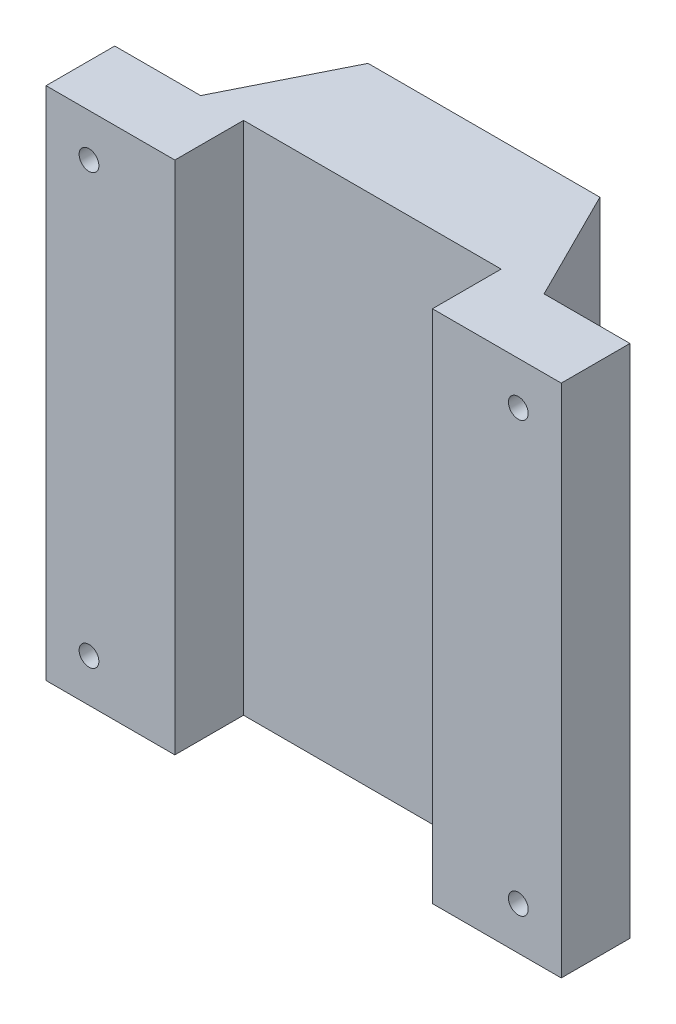
ISO-10303-21;
HEADER;
FILE_DESCRIPTION(('STEP AP214'),'2;1');
FILE_NAME('part.step','',(''),(''),'','','');
FILE_SCHEMA(('AUTOMOTIVE_DESIGN { 1 0 10303 214 1 1 1 1 }'));
ENDSEC;
DATA;
#1=APPLICATION_CONTEXT('core data for automotive mechanical design processes');
#2=APPLICATION_PROTOCOL_DEFINITION('international standard','automotive_design',2000,#1);
#3=PRODUCT_CONTEXT('',#1,'mechanical');
#4=PRODUCT('Part','Part','',(#3));
#5=PRODUCT_RELATED_PRODUCT_CATEGORY('part','',(#4));
#6=PRODUCT_DEFINITION_FORMATION('','',#4);
#7=PRODUCT_DEFINITION_CONTEXT('part definition',#1,'design');
#8=PRODUCT_DEFINITION('design','',#6,#7);
#9=PRODUCT_DEFINITION_SHAPE('','',#8);
#10=(LENGTH_UNIT() NAMED_UNIT(*) SI_UNIT(.MILLI.,.METRE.));
#11=(NAMED_UNIT(*) PLANE_ANGLE_UNIT() SI_UNIT($,.RADIAN.));
#12=(NAMED_UNIT(*) SI_UNIT($,.STERADIAN.) SOLID_ANGLE_UNIT());
#13=UNCERTAINTY_MEASURE_WITH_UNIT(LENGTH_MEASURE(1.E-05),#10,'distance_accuracy_value','');
#14=(GEOMETRIC_REPRESENTATION_CONTEXT(3) GLOBAL_UNCERTAINTY_ASSIGNED_CONTEXT((#13)) GLOBAL_UNIT_ASSIGNED_CONTEXT((#10,
#11,#12)) REPRESENTATION_CONTEXT('',''));
#15=CARTESIAN_POINT('',(0.,0.,0.));
#16=DIRECTION('',(0.,0.,1.));
#17=DIRECTION('',(1.,0.,0.));
#18=AXIS2_PLACEMENT_3D('',#15,#16,#17);
#19=CARTESIAN_POINT('',(30.,30.,13.));
#20=DIRECTION('',(-1.,0.,0.));
#21=DIRECTION('',(0.,0.,1.));
#22=AXIS2_PLACEMENT_3D('',#19,#20,#21);
#23=PLANE('',#22);
#24=DIRECTION('',(0.,1.,0.));
#25=VECTOR('',#24,1.);
#26=CARTESIAN_POINT('',(30.,-30.,13.));
#27=LINE('',#26,#25);
#28=CARTESIAN_POINT('',(30.,-30.,13.));
#29=VERTEX_POINT('',#28);
#30=CARTESIAN_POINT('',(30.,30.,13.));
#31=VERTEX_POINT('',#30);
#32=EDGE_CURVE('E186',#29,#31,#27,.T.);
#33=ORIENTED_EDGE('',*,*,#32,.T.);
#34=DIRECTION('',(0.,0.,-1.));
#35=VECTOR('',#34,1.);
#36=CARTESIAN_POINT('',(30.,30.,13.));
#37=LINE('',#36,#35);
#38=CARTESIAN_POINT('',(30.,30.,21.));
#39=VERTEX_POINT('',#38);
#40=EDGE_CURVE('E11',#39,#31,#37,.T.);
#41=ORIENTED_EDGE('',*,*,#40,.F.);
#42=DIRECTION('',(0.,1.,0.));
#43=VECTOR('',#42,1.);
#44=CARTESIAN_POINT('',(30.,0.,21.));
#45=LINE('',#44,#43);
#46=CARTESIAN_POINT('',(30.,-30.,21.));
#47=VERTEX_POINT('',#46);
#48=EDGE_CURVE('E246',#47,#39,#45,.T.);
#49=ORIENTED_EDGE('',*,*,#48,.F.);
#50=DIRECTION('',(0.,0.,-1.));
#51=VECTOR('',#50,1.);
#52=CARTESIAN_POINT('',(30.,-30.,13.));
#53=LINE('',#52,#51);
#54=EDGE_CURVE('E295',#47,#29,#53,.T.);
#55=ORIENTED_EDGE('',*,*,#54,.T.);
#56=EDGE_LOOP('',(#33,#41,#49,#55));
#57=FACE_BOUND('',#56,.T.);
#58=ADVANCED_FACE('F41',(#57),#23,.F.);
#59=CARTESIAN_POINT('',(-30.,30.,13.));
#60=DIRECTION('',(0.,-1.,0.));
#61=DIRECTION('',(0.,0.,-1.));
#62=AXIS2_PLACEMENT_3D('',#59,#60,#61);
#63=PLANE('',#62);
#64=DIRECTION('',(0.447213595499958,0.,-0.894427190999916));
#65=VECTOR('',#64,1.);
#66=CARTESIAN_POINT('',(-10.8,30.,-5.4));
#67=LINE('',#66,#65);
#68=CARTESIAN_POINT('',(-20.,30.,13.));
#69=VERTEX_POINT('',#68);
#70=CARTESIAN_POINT('',(-13.5,30.,0.));
#71=VERTEX_POINT('',#70);
#72=EDGE_CURVE('E58',#69,#71,#67,.T.);
#73=ORIENTED_EDGE('',*,*,#72,.F.);
#74=DIRECTION('',(1.,0.,0.));
#75=VECTOR('',#74,1.);
#76=CARTESIAN_POINT('',(0.,30.,13.));
#77=LINE('',#76,#75);
#78=CARTESIAN_POINT('',(-30.,30.,13.));
#79=VERTEX_POINT('',#78);
#80=EDGE_CURVE('E140',#79,#69,#77,.T.);
#81=ORIENTED_EDGE('',*,*,#80,.F.);
#82=DIRECTION('',(0.,0.,-1.));
#83=VECTOR('',#82,1.);
#84=CARTESIAN_POINT('',(-30.,30.,13.));
#85=LINE('',#84,#83);
#86=CARTESIAN_POINT('',(-30.,30.,21.));
#87=VERTEX_POINT('',#86);
#88=EDGE_CURVE('E50',#87,#79,#85,.T.);
#89=ORIENTED_EDGE('',*,*,#88,.F.);
#90=DIRECTION('',(-1.,0.,0.));
#91=VECTOR('',#90,1.);
#92=CARTESIAN_POINT('',(0.,30.,21.));
#93=LINE('',#92,#91);
#94=CARTESIAN_POINT('',(-15.,30.,21.));
#95=VERTEX_POINT('',#94);
#96=EDGE_CURVE('E266',#95,#87,#93,.T.);
#97=ORIENTED_EDGE('',*,*,#96,.F.);
#98=DIRECTION('',(0.,0.,-1.));
#99=VECTOR('',#98,1.);
#100=CARTESIAN_POINT('',(-15.,30.,21.));
#101=LINE('',#100,#99);
#102=CARTESIAN_POINT('',(-15.,30.,13.));
#103=VERTEX_POINT('',#102);
#104=EDGE_CURVE('E283',#95,#103,#101,.T.);
#105=ORIENTED_EDGE('',*,*,#104,.T.);
#106=DIRECTION('',(-1.,0.,0.));
#107=VECTOR('',#106,1.);
#108=CARTESIAN_POINT('',(-30.,30.,13.));
#109=LINE('',#108,#107);
#110=CARTESIAN_POINT('',(15.,30.,13.));
#111=VERTEX_POINT('',#110);
#112=EDGE_CURVE('E288',#111,#103,#109,.T.);
#113=ORIENTED_EDGE('',*,*,#112,.F.);
#114=DIRECTION('',(0.,0.,-1.));
#115=VECTOR('',#114,1.);
#116=CARTESIAN_POINT('',(15.,30.,21.));
#117=LINE('',#116,#115);
#118=CARTESIAN_POINT('',(15.,30.,21.));
#119=VERTEX_POINT('',#118);
#120=EDGE_CURVE('E257',#119,#111,#117,.T.);
#121=ORIENTED_EDGE('',*,*,#120,.F.);
#122=DIRECTION('',(-1.,0.,0.));
#123=VECTOR('',#122,1.);
#124=CARTESIAN_POINT('',(0.,30.,21.));
#125=LINE('',#124,#123);
#126=EDGE_CURVE('E235',#39,#119,#125,.T.);
#127=ORIENTED_EDGE('',*,*,#126,.F.);
#128=ORIENTED_EDGE('',*,*,#40,.T.);
#129=DIRECTION('',(-1.,0.,0.));
#130=VECTOR('',#129,1.);
#131=CARTESIAN_POINT('',(0.,30.,13.));
#132=LINE('',#131,#130);
#133=CARTESIAN_POINT('',(20.,30.,13.));
#134=VERTEX_POINT('',#133);
#135=EDGE_CURVE('E173',#31,#134,#132,.T.);
#136=ORIENTED_EDGE('',*,*,#135,.T.);
#137=DIRECTION('',(-0.447213595499959,0.,-0.894427190999915));
#138=VECTOR('',#137,1.);
#139=CARTESIAN_POINT('',(10.8,30.,-5.40000000000001));
#140=LINE('',#139,#138);
#141=CARTESIAN_POINT('',(13.5,30.,0.));
#142=VERTEX_POINT('',#141);
#143=EDGE_CURVE('E177',#134,#142,#140,.T.);
#144=ORIENTED_EDGE('',*,*,#143,.T.);
#145=DIRECTION('',(-1.,0.,0.));
#146=VECTOR('',#145,1.);
#147=CARTESIAN_POINT('',(-30.,30.,0.));
#148=LINE('',#147,#146);
#149=EDGE_CURVE('E287',#142,#71,#148,.T.);
#150=ORIENTED_EDGE('',*,*,#149,.T.);
#151=EDGE_LOOP('',(#73,#81,#89,#97,#105,#113,#121,#127,#128,#136,#144,#150));
#152=FACE_BOUND('',#151,.T.);
#153=ADVANCED_FACE('F349',(#152),#63,.F.);
#154=CARTESIAN_POINT('',(-30.,-30.,13.));
#155=DIRECTION('',(0.,1.,0.));
#156=DIRECTION('',(0.,0.,1.));
#157=AXIS2_PLACEMENT_3D('',#154,#155,#156);
#158=PLANE('',#157);
#159=DIRECTION('',(0.,0.,-1.));
#160=VECTOR('',#159,1.);
#161=CARTESIAN_POINT('',(-30.,-30.,13.));
#162=LINE('',#161,#160);
#163=CARTESIAN_POINT('',(-30.,-30.,21.));
#164=VERTEX_POINT('',#163);
#165=CARTESIAN_POINT('',(-30.,-30.,13.));
#166=VERTEX_POINT('',#165);
#167=EDGE_CURVE('E155',#164,#166,#162,.T.);
#168=ORIENTED_EDGE('',*,*,#167,.T.);
#169=DIRECTION('',(1.,0.,0.));
#170=VECTOR('',#169,1.);
#171=CARTESIAN_POINT('',(0.,-30.,13.));
#172=LINE('',#171,#170);
#173=CARTESIAN_POINT('',(-20.,-30.,13.));
#174=VERTEX_POINT('',#173);
#175=EDGE_CURVE('E137',#166,#174,#172,.T.);
#176=ORIENTED_EDGE('',*,*,#175,.T.);
#177=DIRECTION('',(0.447213595499958,0.,-0.894427190999916));
#178=VECTOR('',#177,1.);
#179=CARTESIAN_POINT('',(-10.8,-30.,-5.4));
#180=LINE('',#179,#178);
#181=CARTESIAN_POINT('',(-13.5,-30.,0.));
#182=VERTEX_POINT('',#181);
#183=EDGE_CURVE('E143',#174,#182,#180,.T.);
#184=ORIENTED_EDGE('',*,*,#183,.T.);
#185=DIRECTION('',(1.,0.,0.));
#186=VECTOR('',#185,1.);
#187=CARTESIAN_POINT('',(-30.,-30.,0.));
#188=LINE('',#187,#186);
#189=CARTESIAN_POINT('',(13.5,-30.,0.));
#190=VERTEX_POINT('',#189);
#191=EDGE_CURVE('E292',#182,#190,#188,.T.);
#192=ORIENTED_EDGE('',*,*,#191,.T.);
#193=DIRECTION('',(-0.447213595499959,0.,-0.894427190999915));
#194=VECTOR('',#193,1.);
#195=CARTESIAN_POINT('',(10.8,-30.,-5.40000000000001));
#196=LINE('',#195,#194);
#197=CARTESIAN_POINT('',(20.,-30.,13.));
#198=VERTEX_POINT('',#197);
#199=EDGE_CURVE('E66',#198,#190,#196,.T.);
#200=ORIENTED_EDGE('',*,*,#199,.F.);
#201=DIRECTION('',(-1.,0.,0.));
#202=VECTOR('',#201,1.);
#203=CARTESIAN_POINT('',(0.,-30.,13.));
#204=LINE('',#203,#202);
#205=EDGE_CURVE('E172',#29,#198,#204,.T.);
#206=ORIENTED_EDGE('',*,*,#205,.F.);
#207=ORIENTED_EDGE('',*,*,#54,.F.);
#208=DIRECTION('',(1.,0.,0.));
#209=VECTOR('',#208,1.);
#210=CARTESIAN_POINT('',(0.,-30.,21.));
#211=LINE('',#210,#209);
#212=CARTESIAN_POINT('',(15.,-30.,21.));
#213=VERTEX_POINT('',#212);
#214=EDGE_CURVE('E242',#213,#47,#211,.T.);
#215=ORIENTED_EDGE('',*,*,#214,.F.);
#216=DIRECTION('',(0.,0.,-1.));
#217=VECTOR('',#216,1.);
#218=CARTESIAN_POINT('',(15.,-30.,21.));
#219=LINE('',#218,#217);
#220=CARTESIAN_POINT('',(15.,-30.,13.));
#221=VERTEX_POINT('',#220);
#222=EDGE_CURVE('E250',#213,#221,#219,.T.);
#223=ORIENTED_EDGE('',*,*,#222,.T.);
#224=DIRECTION('',(1.,0.,0.));
#225=VECTOR('',#224,1.);
#226=CARTESIAN_POINT('',(-30.,-30.,13.));
#227=LINE('',#226,#225);
#228=CARTESIAN_POINT('',(-15.,-30.,13.));
#229=VERTEX_POINT('',#228);
#230=EDGE_CURVE('E291',#229,#221,#227,.T.);
#231=ORIENTED_EDGE('',*,*,#230,.F.);
#232=DIRECTION('',(0.,0.,-1.));
#233=VECTOR('',#232,1.);
#234=CARTESIAN_POINT('',(-15.,-30.,21.));
#235=LINE('',#234,#233);
#236=CARTESIAN_POINT('',(-15.,-30.,21.));
#237=VERTEX_POINT('',#236);
#238=EDGE_CURVE('E277',#237,#229,#235,.T.);
#239=ORIENTED_EDGE('',*,*,#238,.F.);
#240=DIRECTION('',(1.,0.,0.));
#241=VECTOR('',#240,1.);
#242=CARTESIAN_POINT('',(0.,-30.,21.));
#243=LINE('',#242,#241);
#244=EDGE_CURVE('E274',#164,#237,#243,.T.);
#245=ORIENTED_EDGE('',*,*,#244,.F.);
#246=EDGE_LOOP('',(#168,#176,#184,#192,#200,#206,#207,#215,#223,#231,#239,#245));
#247=FACE_BOUND('',#246,.T.);
#248=ADVANCED_FACE('F153',(#247),#158,.F.);
#249=CARTESIAN_POINT('',(0.,0.,0.));
#250=DIRECTION('',(0.,0.,1.));
#251=DIRECTION('',(1.,0.,0.));
#252=AXIS2_PLACEMENT_3D('',#249,#250,#251);
#253=PLANE('',#252);
#254=ORIENTED_EDGE('',*,*,#191,.F.);
#255=DIRECTION('',(0.,1.,0.));
#256=VECTOR('',#255,1.);
#257=CARTESIAN_POINT('',(-13.5,-30.,0.));
#258=LINE('',#257,#256);
#259=EDGE_CURVE('E142',#182,#71,#258,.T.);
#260=ORIENTED_EDGE('',*,*,#259,.T.);
#261=ORIENTED_EDGE('',*,*,#149,.F.);
#262=DIRECTION('',(0.,1.,0.));
#263=VECTOR('',#262,1.);
#264=CARTESIAN_POINT('',(13.5,-30.,0.));
#265=LINE('',#264,#263);
#266=EDGE_CURVE('E162',#190,#142,#265,.T.);
#267=ORIENTED_EDGE('',*,*,#266,.F.);
#268=EDGE_LOOP('',(#254,#260,#261,#267));
#269=FACE_BOUND('',#268,.T.);
#270=ADVANCED_FACE('F342',(#269),#253,.F.);
#271=CARTESIAN_POINT('',(25.,25.,18.));
#272=DIRECTION('',(0.,0.,-1.));
#273=DIRECTION('',(-1.,0.,0.));
#274=AXIS2_PLACEMENT_3D('',#271,#272,#273);
#275=CYLINDRICAL_SURFACE('',#274,2.2);
#276=CARTESIAN_POINT('',(25.,25.,18.));
#277=DIRECTION('',(0.,0.,-1.));
#278=DIRECTION('',(-1.,0.,0.));
#279=AXIS2_PLACEMENT_3D('',#276,#277,#278);
#280=CIRCLE('',#279,2.2);
#281=CARTESIAN_POINT('',(22.8,25.,18.));
#282=VERTEX_POINT('',#281);
#283=EDGE_CURVE('E205',#282,#282,#280,.T.);
#284=ORIENTED_EDGE('',*,*,#283,.F.);
#285=EDGE_LOOP('',(#284));
#286=FACE_BOUND('',#285,.T.);
#287=CARTESIAN_POINT('',(25.,25.,13.));
#288=DIRECTION('',(0.,0.,-1.));
#289=DIRECTION('',(-1.,0.,0.));
#290=AXIS2_PLACEMENT_3D('',#287,#288,#289);
#291=CIRCLE('',#290,2.2);
#292=CARTESIAN_POINT('',(22.8,25.,13.));
#293=VERTEX_POINT('',#292);
#294=EDGE_CURVE('E192',#293,#293,#291,.F.);
#295=ORIENTED_EDGE('',*,*,#294,.F.);
#296=EDGE_LOOP('',(#295));
#297=FACE_BOUND('',#296,.T.);
#298=ADVANCED_FACE('F332',(#286,#297),#275,.F.);
#299=CARTESIAN_POINT('',(24.9999999999986,-25.,18.));
#300=DIRECTION('',(0.,0.,-1.));
#301=DIRECTION('',(-1.,0.,0.));
#302=AXIS2_PLACEMENT_3D('',#299,#300,#301);
#303=CYLINDRICAL_SURFACE('',#302,2.20000000000074);
#304=CARTESIAN_POINT('',(24.9999999999986,-25.,18.));
#305=DIRECTION('',(0.,0.,-1.));
#306=DIRECTION('',(-1.,0.,0.));
#307=AXIS2_PLACEMENT_3D('',#304,#305,#306);
#308=CIRCLE('',#307,2.20000000000074);
#309=CARTESIAN_POINT('',(22.7999999999979,-25.,18.));
#310=VERTEX_POINT('',#309);
#311=EDGE_CURVE('E200',#310,#310,#308,.T.);
#312=ORIENTED_EDGE('',*,*,#311,.F.);
#313=EDGE_LOOP('',(#312));
#314=FACE_BOUND('',#313,.T.);
#315=CARTESIAN_POINT('',(24.9999999999986,-25.,13.));
#316=DIRECTION('',(0.,0.,-1.));
#317=DIRECTION('',(-1.,0.,0.));
#318=AXIS2_PLACEMENT_3D('',#315,#316,#317);
#319=CIRCLE('',#318,2.20000000000074);
#320=CARTESIAN_POINT('',(22.7999999999979,-25.,13.));
#321=VERTEX_POINT('',#320);
#322=EDGE_CURVE('E167',#321,#321,#319,.F.);
#323=ORIENTED_EDGE('',*,*,#322,.F.);
#324=EDGE_LOOP('',(#323));
#325=FACE_BOUND('',#324,.T.);
#326=ADVANCED_FACE('F329',(#314,#325),#303,.F.);
#327=CARTESIAN_POINT('',(24.9999999999986,-25.,21.));
#328=DIRECTION('',(0.,0.,-1.));
#329=DIRECTION('',(-1.,0.,0.));
#330=AXIS2_PLACEMENT_3D('',#327,#328,#329);
#331=CYLINDRICAL_SURFACE('',#330,1.15000000000074);
#332=CARTESIAN_POINT('',(24.9999999999986,-25.,21.));
#333=DIRECTION('',(0.,0.,-1.));
#334=DIRECTION('',(-1.,0.,0.));
#335=AXIS2_PLACEMENT_3D('',#332,#333,#334);
#336=CIRCLE('',#335,1.15000000000074);
#337=CARTESIAN_POINT('',(23.8499999999979,-25.,21.));
#338=VERTEX_POINT('',#337);
#339=EDGE_CURVE('E222',#338,#338,#336,.T.);
#340=ORIENTED_EDGE('',*,*,#339,.F.);
#341=EDGE_LOOP('',(#340));
#342=FACE_BOUND('',#341,.T.);
#343=CARTESIAN_POINT('',(24.9999999999986,-25.,18.));
#344=DIRECTION('',(0.,0.,-1.));
#345=DIRECTION('',(-1.,0.,0.));
#346=AXIS2_PLACEMENT_3D('',#343,#344,#345);
#347=CIRCLE('',#346,1.15000000000074);
#348=CARTESIAN_POINT('',(23.8499999999979,-25.,18.));
#349=VERTEX_POINT('',#348);
#350=EDGE_CURVE('E230',#349,#349,#347,.F.);
#351=ORIENTED_EDGE('',*,*,#350,.F.);
#352=EDGE_LOOP('',(#351));
#353=FACE_BOUND('',#352,.T.);
#354=ADVANCED_FACE('F331',(#342,#353),#331,.F.);
#355=CARTESIAN_POINT('',(25.,25.,21.));
#356=DIRECTION('',(0.,0.,-1.));
#357=DIRECTION('',(-1.,0.,0.));
#358=AXIS2_PLACEMENT_3D('',#355,#356,#357);
#359=CYLINDRICAL_SURFACE('',#358,1.15);
#360=CARTESIAN_POINT('',(25.,25.,21.));
#361=DIRECTION('',(0.,0.,-1.));
#362=DIRECTION('',(-1.,0.,0.));
#363=AXIS2_PLACEMENT_3D('',#360,#361,#362);
#364=CIRCLE('',#363,1.15);
#365=CARTESIAN_POINT('',(23.85,25.,21.));
#366=VERTEX_POINT('',#365);
#367=EDGE_CURVE('E226',#366,#366,#364,.T.);
#368=ORIENTED_EDGE('',*,*,#367,.F.);
#369=EDGE_LOOP('',(#368));
#370=FACE_BOUND('',#369,.T.);
#371=CARTESIAN_POINT('',(25.,25.,18.));
#372=DIRECTION('',(0.,0.,-1.));
#373=DIRECTION('',(-1.,0.,0.));
#374=AXIS2_PLACEMENT_3D('',#371,#372,#373);
#375=CIRCLE('',#374,1.15);
#376=CARTESIAN_POINT('',(23.85,25.,18.));
#377=VERTEX_POINT('',#376);
#378=EDGE_CURVE('E316',#377,#377,#375,.F.);
#379=ORIENTED_EDGE('',*,*,#378,.F.);
#380=EDGE_LOOP('',(#379));
#381=FACE_BOUND('',#380,.T.);
#382=ADVANCED_FACE('F339',(#370,#381),#359,.F.);
#383=CARTESIAN_POINT('',(-25.,25.0000000000014,21.));
#384=DIRECTION('',(0.,0.,-1.));
#385=DIRECTION('',(-1.,0.,0.));
#386=AXIS2_PLACEMENT_3D('',#383,#384,#385);
#387=CYLINDRICAL_SURFACE('',#386,1.15000000000143);
#388=CARTESIAN_POINT('',(-25.,25.0000000000014,21.));
#389=DIRECTION('',(0.,0.,-1.));
#390=DIRECTION('',(-1.,0.,0.));
#391=AXIS2_PLACEMENT_3D('',#388,#389,#390);
#392=CIRCLE('',#391,1.15000000000143);
#393=CARTESIAN_POINT('',(-26.1500000000014,25.0000000000014,21.));
#394=VERTEX_POINT('',#393);
#395=EDGE_CURVE('E221',#394,#394,#392,.T.);
#396=ORIENTED_EDGE('',*,*,#395,.F.);
#397=EDGE_LOOP('',(#396));
#398=FACE_BOUND('',#397,.T.);
#399=CARTESIAN_POINT('',(-25.,25.0000000000014,18.));
#400=DIRECTION('',(0.,0.,-1.));
#401=DIRECTION('',(-1.,0.,0.));
#402=AXIS2_PLACEMENT_3D('',#399,#400,#401);
#403=CIRCLE('',#402,1.15000000000143);
#404=CARTESIAN_POINT('',(-26.1500000000014,25.0000000000014,18.));
#405=VERTEX_POINT('',#404);
#406=EDGE_CURVE('E312',#405,#405,#403,.F.);
#407=ORIENTED_EDGE('',*,*,#406,.F.);
#408=EDGE_LOOP('',(#407));
#409=FACE_BOUND('',#408,.T.);
#410=ADVANCED_FACE('F412',(#398,#409),#387,.F.);
#411=CARTESIAN_POINT('',(-25.0000000000014,-24.9999999999986,21.));
#412=DIRECTION('',(0.,0.,-1.));
#413=DIRECTION('',(-1.,0.,0.));
#414=AXIS2_PLACEMENT_3D('',#411,#412,#413);
#415=CYLINDRICAL_SURFACE('',#414,1.15000000000195);
#416=CARTESIAN_POINT('',(-25.0000000000014,-24.9999999999986,21.));
#417=DIRECTION('',(0.,0.,-1.));
#418=DIRECTION('',(-1.,0.,0.));
#419=AXIS2_PLACEMENT_3D('',#416,#417,#418);
#420=CIRCLE('',#419,1.15000000000195);
#421=CARTESIAN_POINT('',(-26.1500000000033,-24.9999999999986,21.));
#422=VERTEX_POINT('',#421);
#423=EDGE_CURVE('E217',#422,#422,#420,.T.);
#424=ORIENTED_EDGE('',*,*,#423,.F.);
#425=EDGE_LOOP('',(#424));
#426=FACE_BOUND('',#425,.T.);
#427=CARTESIAN_POINT('',(-25.0000000000014,-24.9999999999986,18.));
#428=DIRECTION('',(0.,0.,-1.));
#429=DIRECTION('',(-1.,0.,0.));
#430=AXIS2_PLACEMENT_3D('',#427,#428,#429);
#431=CIRCLE('',#430,1.15000000000195);
#432=CARTESIAN_POINT('',(-26.1500000000033,-24.9999999999986,18.));
#433=VERTEX_POINT('',#432);
#434=EDGE_CURVE('E216',#433,#433,#431,.F.);
#435=ORIENTED_EDGE('',*,*,#434,.F.);
#436=EDGE_LOOP('',(#435));
#437=FACE_BOUND('',#436,.T.);
#438=ADVANCED_FACE('F390',(#426,#437),#415,.F.);
#439=CARTESIAN_POINT('',(0.,0.,13.));
#440=DIRECTION('',(0.,0.,1.));
#441=DIRECTION('',(1.,0.,0.));
#442=AXIS2_PLACEMENT_3D('',#439,#440,#441);
#443=PLANE('',#442);
#444=ORIENTED_EDGE('',*,*,#230,.T.);
#445=DIRECTION('',(0.,-1.,0.));
#446=VECTOR('',#445,1.);
#447=CARTESIAN_POINT('',(15.,0.,13.));
#448=LINE('',#447,#446);
#449=EDGE_CURVE('E234',#111,#221,#448,.T.);
#450=ORIENTED_EDGE('',*,*,#449,.F.);
#451=ORIENTED_EDGE('',*,*,#112,.T.);
#452=DIRECTION('',(0.,-1.,0.));
#453=VECTOR('',#452,1.);
#454=CARTESIAN_POINT('',(-15.,0.,13.));
#455=LINE('',#454,#453);
#456=EDGE_CURVE('E261',#103,#229,#455,.T.);
#457=ORIENTED_EDGE('',*,*,#456,.T.);
#458=EDGE_LOOP('',(#444,#450,#451,#457));
#459=FACE_BOUND('',#458,.T.);
#460=ADVANCED_FACE('F377',(#459),#443,.T.);
#461=CARTESIAN_POINT('',(-30.,30.,13.));
#462=DIRECTION('',(1.,0.,0.));
#463=DIRECTION('',(0.,1.,0.));
#464=AXIS2_PLACEMENT_3D('',#461,#462,#463);
#465=PLANE('',#464);
#466=ORIENTED_EDGE('',*,*,#88,.T.);
#467=DIRECTION('',(0.,1.,0.));
#468=VECTOR('',#467,1.);
#469=CARTESIAN_POINT('',(-30.,-30.,13.));
#470=LINE('',#469,#468);
#471=EDGE_CURVE('E164',#166,#79,#470,.T.);
#472=ORIENTED_EDGE('',*,*,#471,.F.);
#473=ORIENTED_EDGE('',*,*,#167,.F.);
#474=DIRECTION('',(0.,-1.,0.));
#475=VECTOR('',#474,1.);
#476=CARTESIAN_POINT('',(-30.,0.,21.));
#477=LINE('',#476,#475);
#478=EDGE_CURVE('E270',#87,#164,#477,.T.);
#479=ORIENTED_EDGE('',*,*,#478,.F.);
#480=EDGE_LOOP('',(#466,#472,#473,#479));
#481=FACE_BOUND('',#480,.T.);
#482=ADVANCED_FACE('F380',(#481),#465,.F.);
#483=CARTESIAN_POINT('',(-15.,0.,21.));
#484=DIRECTION('',(1.,0.,0.));
#485=DIRECTION('',(0.,0.,-1.));
#486=AXIS2_PLACEMENT_3D('',#483,#484,#485);
#487=PLANE('',#486);
#488=ORIENTED_EDGE('',*,*,#456,.F.);
#489=ORIENTED_EDGE('',*,*,#104,.F.);
#490=DIRECTION('',(0.,-1.,0.));
#491=VECTOR('',#490,1.);
#492=CARTESIAN_POINT('',(-15.,0.,21.));
#493=LINE('',#492,#491);
#494=EDGE_CURVE('E262',#95,#237,#493,.T.);
#495=ORIENTED_EDGE('',*,*,#494,.T.);
#496=ORIENTED_EDGE('',*,*,#238,.T.);
#497=EDGE_LOOP('',(#488,#489,#495,#496));
#498=FACE_BOUND('',#497,.T.);
#499=ADVANCED_FACE('F382',(#498),#487,.T.);
#500=CARTESIAN_POINT('',(0.,0.,21.));
#501=DIRECTION('',(0.,0.,1.));
#502=DIRECTION('',(1.,0.,0.));
#503=AXIS2_PLACEMENT_3D('',#500,#501,#502);
#504=PLANE('',#503);
#505=ORIENTED_EDGE('',*,*,#423,.T.);
#506=EDGE_LOOP('',(#505));
#507=FACE_BOUND('',#506,.T.);
#508=ORIENTED_EDGE('',*,*,#395,.T.);
#509=EDGE_LOOP('',(#508));
#510=FACE_BOUND('',#509,.T.);
#511=ORIENTED_EDGE('',*,*,#494,.F.);
#512=ORIENTED_EDGE('',*,*,#96,.T.);
#513=ORIENTED_EDGE('',*,*,#478,.T.);
#514=ORIENTED_EDGE('',*,*,#244,.T.);
#515=EDGE_LOOP('',(#511,#512,#513,#514));
#516=FACE_BOUND('',#515,.T.);
#517=ADVANCED_FACE('F388',(#507,#510,#516),#504,.T.);
#518=CARTESIAN_POINT('',(15.,0.,21.));
#519=DIRECTION('',(1.,0.,0.));
#520=DIRECTION('',(0.,0.,-1.));
#521=AXIS2_PLACEMENT_3D('',#518,#519,#520);
#522=PLANE('',#521);
#523=ORIENTED_EDGE('',*,*,#449,.T.);
#524=ORIENTED_EDGE('',*,*,#222,.F.);
#525=DIRECTION('',(0.,-1.,0.));
#526=VECTOR('',#525,1.);
#527=CARTESIAN_POINT('',(15.,0.,21.));
#528=LINE('',#527,#526);
#529=EDGE_CURVE('E239',#119,#213,#528,.T.);
#530=ORIENTED_EDGE('',*,*,#529,.F.);
#531=ORIENTED_EDGE('',*,*,#120,.T.);
#532=EDGE_LOOP('',(#523,#524,#530,#531));
#533=FACE_BOUND('',#532,.T.);
#534=ADVANCED_FACE('F399',(#533),#522,.F.);
#535=CARTESIAN_POINT('',(0.,0.,21.));
#536=DIRECTION('',(0.,0.,1.));
#537=DIRECTION('',(1.,0.,0.));
#538=AXIS2_PLACEMENT_3D('',#535,#536,#537);
#539=PLANE('',#538);
#540=ORIENTED_EDGE('',*,*,#367,.T.);
#541=EDGE_LOOP('',(#540));
#542=FACE_BOUND('',#541,.T.);
#543=ORIENTED_EDGE('',*,*,#339,.T.);
#544=EDGE_LOOP('',(#543));
#545=FACE_BOUND('',#544,.T.);
#546=ORIENTED_EDGE('',*,*,#126,.T.);
#547=ORIENTED_EDGE('',*,*,#529,.T.);
#548=ORIENTED_EDGE('',*,*,#214,.T.);
#549=ORIENTED_EDGE('',*,*,#48,.T.);
#550=EDGE_LOOP('',(#546,#547,#548,#549));
#551=FACE_BOUND('',#550,.T.);
#552=ADVANCED_FACE('F362',(#542,#545,#551),#539,.T.);
#553=CARTESIAN_POINT('',(-25.0000000000014,-24.9999999999986,18.));
#554=DIRECTION('',(0.,0.,-1.));
#555=DIRECTION('',(-1.,0.,0.));
#556=AXIS2_PLACEMENT_3D('',#553,#554,#555);
#557=PLANE('',#556);
#558=CARTESIAN_POINT('',(-25.0000000000014,-24.9999999999986,18.));
#559=DIRECTION('',(0.,0.,-1.));
#560=DIRECTION('',(-1.,0.,0.));
#561=AXIS2_PLACEMENT_3D('',#558,#559,#560);
#562=CIRCLE('',#561,2.20000000000195);
#563=CARTESIAN_POINT('',(-27.2000000000033,-24.9999999999986,18.));
#564=VERTEX_POINT('',#563);
#565=EDGE_CURVE('E206',#564,#564,#562,.T.);
#566=ORIENTED_EDGE('',*,*,#565,.T.);
#567=EDGE_LOOP('',(#566));
#568=FACE_BOUND('',#567,.T.);
#569=ORIENTED_EDGE('',*,*,#434,.T.);
#570=EDGE_LOOP('',(#569));
#571=FACE_BOUND('',#570,.T.);
#572=ADVANCED_FACE('F406',(#568,#571),#557,.T.);
#573=CARTESIAN_POINT('',(-25.0000000000014,-24.9999999999986,18.));
#574=DIRECTION('',(0.,0.,-1.));
#575=DIRECTION('',(-1.,0.,0.));
#576=AXIS2_PLACEMENT_3D('',#573,#574,#575);
#577=CYLINDRICAL_SURFACE('',#576,2.20000000000195);
#578=CARTESIAN_POINT('',(-25.0000000000014,-24.9999999999986,13.));
#579=DIRECTION('',(0.,0.,1.));
#580=DIRECTION('',(1.,0.,0.));
#581=AXIS2_PLACEMENT_3D('',#578,#579,#580);
#582=CIRCLE('',#581,2.20000000000195);
#583=CARTESIAN_POINT('',(-22.7999999999994,-24.9999999999986,13.));
#584=VERTEX_POINT('',#583);
#585=EDGE_CURVE('E196',#584,#584,#582,.F.);
#586=ORIENTED_EDGE('',*,*,#585,.T.);
#587=EDGE_LOOP('',(#586));
#588=FACE_BOUND('',#587,.T.);
#589=ORIENTED_EDGE('',*,*,#565,.F.);
#590=EDGE_LOOP('',(#589));
#591=FACE_BOUND('',#590,.T.);
#592=ADVANCED_FACE('F450',(#588,#591),#577,.F.);
#593=CARTESIAN_POINT('',(-25.,25.0000000000014,18.));
#594=DIRECTION('',(0.,0.,-1.));
#595=DIRECTION('',(-1.,0.,0.));
#596=AXIS2_PLACEMENT_3D('',#593,#594,#595);
#597=PLANE('',#596);
#598=CARTESIAN_POINT('',(-25.,25.0000000000014,18.));
#599=DIRECTION('',(0.,0.,-1.));
#600=DIRECTION('',(-1.,0.,0.));
#601=AXIS2_PLACEMENT_3D('',#598,#599,#600);
#602=CIRCLE('',#601,2.20000000000143);
#603=CARTESIAN_POINT('',(-27.2000000000014,25.0000000000014,18.));
#604=VERTEX_POINT('',#603);
#605=EDGE_CURVE('E201',#604,#604,#602,.T.);
#606=ORIENTED_EDGE('',*,*,#605,.T.);
#607=EDGE_LOOP('',(#606));
#608=FACE_BOUND('',#607,.T.);
#609=ORIENTED_EDGE('',*,*,#406,.T.);
#610=EDGE_LOOP('',(#609));
#611=FACE_BOUND('',#610,.T.);
#612=ADVANCED_FACE('F431',(#608,#611),#597,.T.);
#613=CARTESIAN_POINT('',(-25.,25.0000000000014,18.));
#614=DIRECTION('',(0.,0.,-1.));
#615=DIRECTION('',(-1.,0.,0.));
#616=AXIS2_PLACEMENT_3D('',#613,#614,#615);
#617=CYLINDRICAL_SURFACE('',#616,2.20000000000143);
#618=CARTESIAN_POINT('',(-25.,25.0000000000014,13.));
#619=DIRECTION('',(0.,0.,1.));
#620=DIRECTION('',(1.,0.,0.));
#621=AXIS2_PLACEMENT_3D('',#618,#619,#620);
#622=CIRCLE('',#621,2.20000000000143);
#623=CARTESIAN_POINT('',(-22.7999999999986,25.0000000000014,13.));
#624=VERTEX_POINT('',#623);
#625=EDGE_CURVE('E44',#624,#624,#622,.F.);
#626=ORIENTED_EDGE('',*,*,#625,.T.);
#627=EDGE_LOOP('',(#626));
#628=FACE_BOUND('',#627,.T.);
#629=ORIENTED_EDGE('',*,*,#605,.F.);
#630=EDGE_LOOP('',(#629));
#631=FACE_BOUND('',#630,.T.);
#632=ADVANCED_FACE('F424',(#628,#631),#617,.F.);
#633=CARTESIAN_POINT('',(25.,25.,18.));
#634=DIRECTION('',(0.,0.,-1.));
#635=DIRECTION('',(-1.,0.,0.));
#636=AXIS2_PLACEMENT_3D('',#633,#634,#635);
#637=PLANE('',#636);
#638=ORIENTED_EDGE('',*,*,#283,.T.);
#639=EDGE_LOOP('',(#638));
#640=FACE_BOUND('',#639,.T.);
#641=ORIENTED_EDGE('',*,*,#378,.T.);
#642=EDGE_LOOP('',(#641));
#643=FACE_BOUND('',#642,.T.);
#644=ADVANCED_FACE('F421',(#640,#643),#637,.T.);
#645=CARTESIAN_POINT('',(24.9999999999986,-25.,18.));
#646=DIRECTION('',(0.,0.,-1.));
#647=DIRECTION('',(-1.,0.,0.));
#648=AXIS2_PLACEMENT_3D('',#645,#646,#647);
#649=PLANE('',#648);
#650=ORIENTED_EDGE('',*,*,#311,.T.);
#651=EDGE_LOOP('',(#650));
#652=FACE_BOUND('',#651,.T.);
#653=ORIENTED_EDGE('',*,*,#350,.T.);
#654=EDGE_LOOP('',(#653));
#655=FACE_BOUND('',#654,.T.);
#656=ADVANCED_FACE('F423',(#652,#655),#649,.T.);
#657=CARTESIAN_POINT('',(0.,-30.,13.));
#658=DIRECTION('',(0.,0.,-1.));
#659=DIRECTION('',(-1.,0.,0.));
#660=AXIS2_PLACEMENT_3D('',#657,#658,#659);
#661=PLANE('',#660);
#662=ORIENTED_EDGE('',*,*,#135,.F.);
#663=ORIENTED_EDGE('',*,*,#32,.F.);
#664=ORIENTED_EDGE('',*,*,#205,.T.);
#665=DIRECTION('',(0.,1.,0.));
#666=VECTOR('',#665,1.);
#667=CARTESIAN_POINT('',(20.,-30.,13.));
#668=LINE('',#667,#666);
#669=EDGE_CURVE('E176',#198,#134,#668,.T.);
#670=ORIENTED_EDGE('',*,*,#669,.T.);
#671=EDGE_LOOP('',(#662,#663,#664,#670));
#672=FACE_BOUND('',#671,.T.);
#673=ORIENTED_EDGE('',*,*,#322,.T.);
#674=EDGE_LOOP('',(#673));
#675=FACE_BOUND('',#674,.T.);
#676=ORIENTED_EDGE('',*,*,#294,.T.);
#677=EDGE_LOOP('',(#676));
#678=FACE_BOUND('',#677,.T.);
#679=ADVANCED_FACE('F326',(#672,#675,#678),#661,.T.);
#680=CARTESIAN_POINT('',(10.8,-30.,-5.40000000000001));
#681=DIRECTION('',(0.894427190999915,0.,-0.447213595499959));
#682=DIRECTION('',(-0.447213595499959,0.,-0.894427190999915));
#683=AXIS2_PLACEMENT_3D('',#680,#681,#682);
#684=PLANE('',#683);
#685=ORIENTED_EDGE('',*,*,#143,.F.);
#686=ORIENTED_EDGE('',*,*,#669,.F.);
#687=ORIENTED_EDGE('',*,*,#199,.T.);
#688=ORIENTED_EDGE('',*,*,#266,.T.);
#689=EDGE_LOOP('',(#685,#686,#687,#688));
#690=FACE_BOUND('',#689,.T.);
#691=ADVANCED_FACE('F367',(#690),#684,.T.);
#692=CARTESIAN_POINT('',(0.,-30.,13.));
#693=DIRECTION('',(0.,0.,1.));
#694=DIRECTION('',(1.,0.,0.));
#695=AXIS2_PLACEMENT_3D('',#692,#693,#694);
#696=PLANE('',#695);
#697=ORIENTED_EDGE('',*,*,#625,.F.);
#698=EDGE_LOOP('',(#697));
#699=FACE_BOUND('',#698,.T.);
#700=ORIENTED_EDGE('',*,*,#80,.T.);
#701=DIRECTION('',(0.,1.,0.));
#702=VECTOR('',#701,1.);
#703=CARTESIAN_POINT('',(-20.,-30.,13.));
#704=LINE('',#703,#702);
#705=EDGE_CURVE('E132',#174,#69,#704,.T.);
#706=ORIENTED_EDGE('',*,*,#705,.F.);
#707=ORIENTED_EDGE('',*,*,#175,.F.);
#708=ORIENTED_EDGE('',*,*,#471,.T.);
#709=EDGE_LOOP('',(#700,#706,#707,#708));
#710=FACE_BOUND('',#709,.T.);
#711=ORIENTED_EDGE('',*,*,#585,.F.);
#712=EDGE_LOOP('',(#711));
#713=FACE_BOUND('',#712,.T.);
#714=ADVANCED_FACE('F134',(#699,#710,#713),#696,.F.);
#715=CARTESIAN_POINT('',(-10.8,-30.,-5.4));
#716=DIRECTION('',(0.894427190999916,0.,0.447213595499958));
#717=DIRECTION('',(0.447213595499958,0.,-0.894427190999916));
#718=AXIS2_PLACEMENT_3D('',#715,#716,#717);
#719=PLANE('',#718);
#720=ORIENTED_EDGE('',*,*,#72,.T.);
#721=ORIENTED_EDGE('',*,*,#259,.F.);
#722=ORIENTED_EDGE('',*,*,#183,.F.);
#723=ORIENTED_EDGE('',*,*,#705,.T.);
#724=EDGE_LOOP('',(#720,#721,#722,#723));
#725=FACE_BOUND('',#724,.T.);
#726=ADVANCED_FACE('F146',(#725),#719,.F.);
#727=CLOSED_SHELL('',(#58,#153,#248,#270,#298,#326,#354,#382,#410,#438,#460,#482,#499,#517,#534,
#552,#572,#592,#612,#632,#644,#656,#679,#691,#714,#726));
#728=MANIFOLD_SOLID_BREP('B2',#727);
#729=ADVANCED_BREP_SHAPE_REPRESENTATION('',(#18,#728),#14);
#730=SHAPE_DEFINITION_REPRESENTATION(#9,#729);
ENDSEC;
END-ISO-10303-21;
